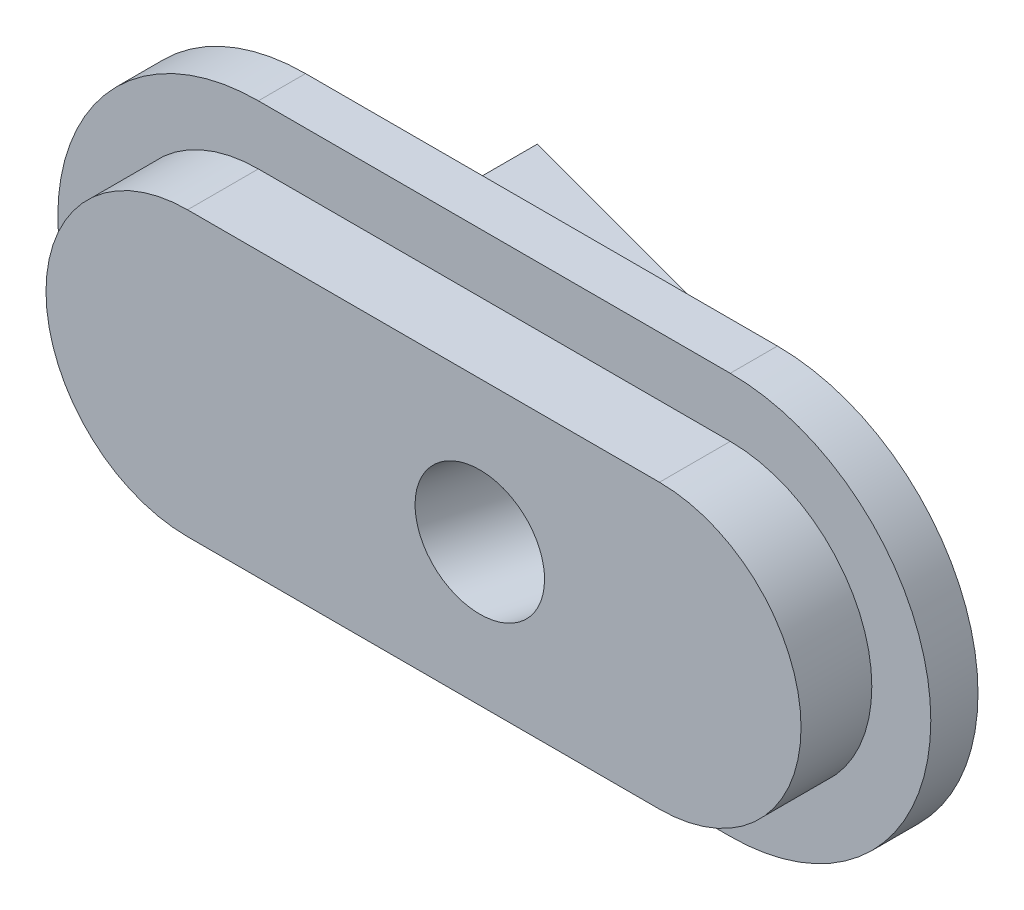
ISO-10303-21;
HEADER;
FILE_DESCRIPTION(('STEP AP214'),'2;1');
FILE_NAME('part.step','',(''),(''),'','','');
FILE_SCHEMA(('AUTOMOTIVE_DESIGN { 1 0 10303 214 1 1 1 1 }'));
ENDSEC;
DATA;
#1=APPLICATION_CONTEXT('core data for automotive mechanical design processes');
#2=APPLICATION_PROTOCOL_DEFINITION('international standard','automotive_design',2000,#1);
#3=PRODUCT_CONTEXT('',#1,'mechanical');
#4=PRODUCT('Part','Part','',(#3));
#5=PRODUCT_RELATED_PRODUCT_CATEGORY('part','',(#4));
#6=PRODUCT_DEFINITION_FORMATION('','',#4);
#7=PRODUCT_DEFINITION_CONTEXT('part definition',#1,'design');
#8=PRODUCT_DEFINITION('design','',#6,#7);
#9=PRODUCT_DEFINITION_SHAPE('','',#8);
#10=(LENGTH_UNIT() NAMED_UNIT(*) SI_UNIT(.MILLI.,.METRE.));
#11=(NAMED_UNIT(*) PLANE_ANGLE_UNIT() SI_UNIT($,.RADIAN.));
#12=(NAMED_UNIT(*) SI_UNIT($,.STERADIAN.) SOLID_ANGLE_UNIT());
#13=UNCERTAINTY_MEASURE_WITH_UNIT(LENGTH_MEASURE(1.E-05),#10,'distance_accuracy_value','');
#14=(GEOMETRIC_REPRESENTATION_CONTEXT(3) GLOBAL_UNCERTAINTY_ASSIGNED_CONTEXT((#13)) GLOBAL_UNIT_ASSIGNED_CONTEXT((#10,
#11,#12)) REPRESENTATION_CONTEXT('',''));
#15=CARTESIAN_POINT('',(0.,0.,0.));
#16=DIRECTION('',(0.,0.,1.));
#17=DIRECTION('',(1.,0.,0.));
#18=AXIS2_PLACEMENT_3D('',#15,#16,#17);
#19=CARTESIAN_POINT('',(-10.,0.,5.));
#20=DIRECTION('',(0.,0.,-1.));
#21=DIRECTION('',(-1.,0.,0.));
#22=AXIS2_PLACEMENT_3D('',#19,#20,#21);
#23=CYLINDRICAL_SURFACE('',#22,6.);
#24=DIRECTION('',(0.,0.,-1.));
#25=VECTOR('',#24,1.);
#26=CARTESIAN_POINT('',(-10.,-5.99999999999999,5.));
#27=LINE('',#26,#25);
#28=CARTESIAN_POINT('',(-10.,-5.99999999999999,0.));
#29=VERTEX_POINT('',#28);
#30=CARTESIAN_POINT('',(-10.,-5.99999999999999,-3.));
#31=VERTEX_POINT('',#30);
#32=EDGE_CURVE('E70',#29,#31,#27,.T.);
#33=ORIENTED_EDGE('',*,*,#32,.F.);
#34=CARTESIAN_POINT('',(-10.,0.,0.));
#35=DIRECTION('',(0.,0.,-1.));
#36=DIRECTION('',(-1.,0.,0.));
#37=AXIS2_PLACEMENT_3D('',#34,#35,#36);
#38=CIRCLE('',#37,6.);
#39=CARTESIAN_POINT('',(-10.,6.00000000000001,0.));
#40=VERTEX_POINT('',#39);
#41=EDGE_CURVE('E132',#29,#40,#38,.T.);
#42=ORIENTED_EDGE('',*,*,#41,.T.);
#43=DIRECTION('',(0.,0.,-1.));
#44=VECTOR('',#43,1.);
#45=CARTESIAN_POINT('',(-10.,6.00000000000001,5.));
#46=LINE('',#45,#44);
#47=CARTESIAN_POINT('',(-10.,6.00000000000001,-3.));
#48=VERTEX_POINT('',#47);
#49=EDGE_CURVE('E139',#40,#48,#46,.T.);
#50=ORIENTED_EDGE('',*,*,#49,.T.);
#51=CARTESIAN_POINT('',(-10.,0.,-3.));
#52=DIRECTION('',(0.,0.,-1.));
#53=DIRECTION('',(-1.,0.,0.));
#54=AXIS2_PLACEMENT_3D('',#51,#52,#53);
#55=CIRCLE('',#54,6.);
#56=EDGE_CURVE('E213',#31,#48,#55,.T.);
#57=ORIENTED_EDGE('',*,*,#56,.F.);
#58=EDGE_LOOP('',(#33,#42,#50,#57));
#59=FACE_BOUND('',#58,.T.);
#60=ADVANCED_FACE('F45',(#59),#23,.T.);
#61=CARTESIAN_POINT('',(-10.,-5.99999999999999,5.));
#62=DIRECTION('',(0.,1.,0.));
#63=DIRECTION('',(0.,0.,1.));
#64=AXIS2_PLACEMENT_3D('',#61,#62,#63);
#65=PLANE('',#64);
#66=DIRECTION('',(0.,0.,-1.));
#67=VECTOR('',#66,1.);
#68=CARTESIAN_POINT('',(10.,-6.,5.));
#69=LINE('',#68,#67);
#70=CARTESIAN_POINT('',(10.,-6.,0.));
#71=VERTEX_POINT('',#70);
#72=CARTESIAN_POINT('',(10.,-6.,-3.));
#73=VERTEX_POINT('',#72);
#74=EDGE_CURVE('E153',#71,#73,#69,.T.);
#75=ORIENTED_EDGE('',*,*,#74,.F.);
#76=DIRECTION('',(-1.,0.,0.));
#77=VECTOR('',#76,1.);
#78=CARTESIAN_POINT('',(-10.,-5.99999999999999,0.));
#79=LINE('',#78,#77);
#80=EDGE_CURVE('E143',#71,#29,#79,.T.);
#81=ORIENTED_EDGE('',*,*,#80,.T.);
#82=ORIENTED_EDGE('',*,*,#32,.T.);
#83=DIRECTION('',(-1.,0.,0.));
#84=VECTOR('',#83,1.);
#85=CARTESIAN_POINT('',(-10.,-5.99999999999999,-3.));
#86=LINE('',#85,#84);
#87=EDGE_CURVE('E209',#73,#31,#86,.T.);
#88=ORIENTED_EDGE('',*,*,#87,.F.);
#89=EDGE_LOOP('',(#75,#81,#82,#88));
#90=FACE_BOUND('',#89,.T.);
#91=ADVANCED_FACE('F275',(#90),#65,.F.);
#92=CARTESIAN_POINT('',(10.,0.,5.));
#93=DIRECTION('',(0.,0.,-1.));
#94=DIRECTION('',(-1.,0.,0.));
#95=AXIS2_PLACEMENT_3D('',#92,#93,#94);
#96=CYLINDRICAL_SURFACE('',#95,6.);
#97=DIRECTION('',(0.,0.,-1.));
#98=VECTOR('',#97,1.);
#99=CARTESIAN_POINT('',(10.,6.00000000000001,5.));
#100=LINE('',#99,#98);
#101=CARTESIAN_POINT('',(10.,6.00000000000001,0.));
#102=VERTEX_POINT('',#101);
#103=CARTESIAN_POINT('',(10.,6.00000000000001,-3.));
#104=VERTEX_POINT('',#103);
#105=EDGE_CURVE('E148',#102,#104,#100,.T.);
#106=ORIENTED_EDGE('',*,*,#105,.F.);
#107=CARTESIAN_POINT('',(10.,0.,0.));
#108=DIRECTION('',(0.,0.,-1.));
#109=DIRECTION('',(-1.,0.,0.));
#110=AXIS2_PLACEMENT_3D('',#107,#108,#109);
#111=CIRCLE('',#110,6.);
#112=EDGE_CURVE('E62',#102,#71,#111,.T.);
#113=ORIENTED_EDGE('',*,*,#112,.T.);
#114=ORIENTED_EDGE('',*,*,#74,.T.);
#115=CARTESIAN_POINT('',(10.,0.,-3.));
#116=DIRECTION('',(0.,0.,-1.));
#117=DIRECTION('',(-1.,0.,0.));
#118=AXIS2_PLACEMENT_3D('',#115,#116,#117);
#119=CIRCLE('',#118,6.);
#120=EDGE_CURVE('E194',#104,#73,#119,.T.);
#121=ORIENTED_EDGE('',*,*,#120,.F.);
#122=EDGE_LOOP('',(#106,#113,#114,#121));
#123=FACE_BOUND('',#122,.T.);
#124=ADVANCED_FACE('F273',(#123),#96,.T.);
#125=CARTESIAN_POINT('',(-10.,6.00000000000001,5.));
#126=DIRECTION('',(0.,-1.,0.));
#127=DIRECTION('',(1.,0.,0.));
#128=AXIS2_PLACEMENT_3D('',#125,#126,#127);
#129=PLANE('',#128);
#130=ORIENTED_EDGE('',*,*,#49,.F.);
#131=DIRECTION('',(1.,0.,0.));
#132=VECTOR('',#131,1.);
#133=CARTESIAN_POINT('',(-10.,6.00000000000001,0.));
#134=LINE('',#133,#132);
#135=EDGE_CURVE('E129',#40,#102,#134,.T.);
#136=ORIENTED_EDGE('',*,*,#135,.T.);
#137=ORIENTED_EDGE('',*,*,#105,.T.);
#138=DIRECTION('',(1.,0.,0.));
#139=VECTOR('',#138,1.);
#140=CARTESIAN_POINT('',(-10.,6.00000000000001,-3.));
#141=LINE('',#140,#139);
#142=EDGE_CURVE('E11',#48,#104,#141,.T.);
#143=ORIENTED_EDGE('',*,*,#142,.F.);
#144=EDGE_LOOP('',(#130,#136,#137,#143));
#145=FACE_BOUND('',#144,.T.);
#146=ADVANCED_FACE('F145',(#145),#129,.F.);
#147=CARTESIAN_POINT('',(-10.,0.,-3.));
#148=DIRECTION('',(0.,0.,-1.));
#149=DIRECTION('',(1.,0.,0.));
#150=AXIS2_PLACEMENT_3D('',#147,#148,#149);
#151=PLANE('',#150);
#152=CARTESIAN_POINT('',(-10.,0.,-3.));
#153=DIRECTION('',(0.,0.,1.));
#154=DIRECTION('',(1.,0.,0.));
#155=AXIS2_PLACEMENT_3D('',#152,#153,#154);
#156=CIRCLE('',#155,8.5);
#157=CARTESIAN_POINT('',(-10.,8.50000000000001,-3.));
#158=VERTEX_POINT('',#157);
#159=CARTESIAN_POINT('',(-10.,-8.49999999999999,-3.));
#160=VERTEX_POINT('',#159);
#161=EDGE_CURVE('E189',#158,#160,#156,.T.);
#162=ORIENTED_EDGE('',*,*,#161,.T.);
#163=DIRECTION('',(1.,0.,0.));
#164=VECTOR('',#163,1.);
#165=CARTESIAN_POINT('',(-10.,-8.49999999999999,-3.));
#166=LINE('',#165,#164);
#167=CARTESIAN_POINT('',(10.,-8.49999999999999,-3.));
#168=VERTEX_POINT('',#167);
#169=EDGE_CURVE('E181',#160,#168,#166,.T.);
#170=ORIENTED_EDGE('',*,*,#169,.T.);
#171=CARTESIAN_POINT('',(10.,0.,-3.));
#172=DIRECTION('',(0.,0.,1.));
#173=DIRECTION('',(1.,0.,0.));
#174=AXIS2_PLACEMENT_3D('',#171,#172,#173);
#175=CIRCLE('',#174,8.5);
#176=CARTESIAN_POINT('',(10.,8.50000000000001,-3.));
#177=VERTEX_POINT('',#176);
#178=EDGE_CURVE('E258',#168,#177,#175,.T.);
#179=ORIENTED_EDGE('',*,*,#178,.T.);
#180=DIRECTION('',(-1.,0.,0.));
#181=VECTOR('',#180,1.);
#182=CARTESIAN_POINT('',(-10.,8.50000000000001,-3.));
#183=LINE('',#182,#181);
#184=EDGE_CURVE('E260',#177,#158,#183,.T.);
#185=ORIENTED_EDGE('',*,*,#184,.T.);
#186=EDGE_LOOP('',(#162,#170,#179,#185));
#187=FACE_BOUND('',#186,.T.);
#188=ORIENTED_EDGE('',*,*,#87,.T.);
#189=ORIENTED_EDGE('',*,*,#56,.T.);
#190=ORIENTED_EDGE('',*,*,#142,.T.);
#191=ORIENTED_EDGE('',*,*,#120,.T.);
#192=EDGE_LOOP('',(#188,#189,#190,#191));
#193=FACE_BOUND('',#192,.T.);
#194=ADVANCED_FACE('F277',(#187,#193),#151,.F.);
#195=CARTESIAN_POINT('',(-10.,0.,-3.));
#196=DIRECTION('',(0.,0.,-1.));
#197=DIRECTION('',(-1.,0.,0.));
#198=AXIS2_PLACEMENT_3D('',#195,#196,#197);
#199=CYLINDRICAL_SURFACE('',#198,8.5);
#200=CARTESIAN_POINT('',(-10.,0.,-5.));
#201=DIRECTION('',(0.,0.,1.));
#202=DIRECTION('',(1.,0.,0.));
#203=AXIS2_PLACEMENT_3D('',#200,#201,#202);
#204=CIRCLE('',#203,8.5);
#205=CARTESIAN_POINT('',(-10.,8.50000000000001,-5.));
#206=VERTEX_POINT('',#205);
#207=CARTESIAN_POINT('',(-10.,-8.49999999999999,-5.));
#208=VERTEX_POINT('',#207);
#209=EDGE_CURVE('E166',#206,#208,#204,.T.);
#210=ORIENTED_EDGE('',*,*,#209,.T.);
#211=DIRECTION('',(0.,0.,-1.));
#212=VECTOR('',#211,1.);
#213=CARTESIAN_POINT('',(-10.,-8.49999999999999,-3.));
#214=LINE('',#213,#212);
#215=EDGE_CURVE('E190',#160,#208,#214,.T.);
#216=ORIENTED_EDGE('',*,*,#215,.F.);
#217=ORIENTED_EDGE('',*,*,#161,.F.);
#218=DIRECTION('',(0.,0.,-1.));
#219=VECTOR('',#218,1.);
#220=CARTESIAN_POINT('',(-10.,8.50000000000001,-3.));
#221=LINE('',#220,#219);
#222=EDGE_CURVE('E203',#158,#206,#221,.T.);
#223=ORIENTED_EDGE('',*,*,#222,.T.);
#224=EDGE_LOOP('',(#210,#216,#217,#223));
#225=FACE_BOUND('',#224,.T.);
#226=ADVANCED_FACE('F279',(#225),#199,.T.);
#227=CARTESIAN_POINT('',(-10.,-8.49999999999999,-3.));
#228=DIRECTION('',(0.,1.,0.));
#229=DIRECTION('',(0.,0.,1.));
#230=AXIS2_PLACEMENT_3D('',#227,#228,#229);
#231=PLANE('',#230);
#232=DIRECTION('',(1.,0.,0.));
#233=VECTOR('',#232,1.);
#234=CARTESIAN_POINT('',(-10.,-8.49999999999999,-5.));
#235=LINE('',#234,#233);
#236=CARTESIAN_POINT('',(10.,-8.49999999999999,-5.));
#237=VERTEX_POINT('',#236);
#238=EDGE_CURVE('E186',#208,#237,#235,.T.);
#239=ORIENTED_EDGE('',*,*,#238,.T.);
#240=DIRECTION('',(0.,0.,-1.));
#241=VECTOR('',#240,1.);
#242=CARTESIAN_POINT('',(10.,-8.49999999999999,-3.));
#243=LINE('',#242,#241);
#244=EDGE_CURVE('E195',#168,#237,#243,.T.);
#245=ORIENTED_EDGE('',*,*,#244,.F.);
#246=ORIENTED_EDGE('',*,*,#169,.F.);
#247=ORIENTED_EDGE('',*,*,#215,.T.);
#248=EDGE_LOOP('',(#239,#245,#246,#247));
#249=FACE_BOUND('',#248,.T.);
#250=ADVANCED_FACE('F284',(#249),#231,.F.);
#251=CARTESIAN_POINT('',(10.,0.,-3.));
#252=DIRECTION('',(0.,0.,-1.));
#253=DIRECTION('',(-1.,0.,0.));
#254=AXIS2_PLACEMENT_3D('',#251,#252,#253);
#255=CYLINDRICAL_SURFACE('',#254,8.5);
#256=CARTESIAN_POINT('',(10.,0.,-5.));
#257=DIRECTION('',(0.,0.,1.));
#258=DIRECTION('',(1.,0.,0.));
#259=AXIS2_PLACEMENT_3D('',#256,#257,#258);
#260=CIRCLE('',#259,8.5);
#261=CARTESIAN_POINT('',(10.,8.50000000000001,-5.));
#262=VERTEX_POINT('',#261);
#263=EDGE_CURVE('E178',#237,#262,#260,.T.);
#264=ORIENTED_EDGE('',*,*,#263,.T.);
#265=DIRECTION('',(0.,0.,-1.));
#266=VECTOR('',#265,1.);
#267=CARTESIAN_POINT('',(10.,8.50000000000001,-3.));
#268=LINE('',#267,#266);
#269=EDGE_CURVE('E199',#177,#262,#268,.T.);
#270=ORIENTED_EDGE('',*,*,#269,.F.);
#271=ORIENTED_EDGE('',*,*,#178,.F.);
#272=ORIENTED_EDGE('',*,*,#244,.T.);
#273=EDGE_LOOP('',(#264,#270,#271,#272));
#274=FACE_BOUND('',#273,.T.);
#275=ADVANCED_FACE('F318',(#274),#255,.T.);
#276=CARTESIAN_POINT('',(-10.,8.50000000000001,-3.));
#277=DIRECTION('',(0.,-1.,0.));
#278=DIRECTION('',(0.,0.,-1.));
#279=AXIS2_PLACEMENT_3D('',#276,#277,#278);
#280=PLANE('',#279);
#281=DIRECTION('',(-1.,0.,0.));
#282=VECTOR('',#281,1.);
#283=CARTESIAN_POINT('',(-10.,8.50000000000001,-5.));
#284=LINE('',#283,#282);
#285=EDGE_CURVE('E171',#262,#206,#284,.T.);
#286=ORIENTED_EDGE('',*,*,#285,.T.);
#287=ORIENTED_EDGE('',*,*,#222,.F.);
#288=ORIENTED_EDGE('',*,*,#184,.F.);
#289=ORIENTED_EDGE('',*,*,#269,.T.);
#290=EDGE_LOOP('',(#286,#287,#288,#289));
#291=FACE_BOUND('',#290,.T.);
#292=ADVANCED_FACE('F313',(#291),#280,.F.);
#293=CARTESIAN_POINT('',(-10.,0.,-5.));
#294=DIRECTION('',(0.,0.,1.));
#295=DIRECTION('',(1.,0.,0.));
#296=AXIS2_PLACEMENT_3D('',#293,#294,#295);
#297=PLANE('',#296);
#298=DIRECTION('',(0.,-1.,0.));
#299=VECTOR('',#298,1.);
#300=CARTESIAN_POINT('',(-5.,24.6349712473815,-5.));
#301=LINE('',#300,#299);
#302=CARTESIAN_POINT('',(-5.,6.00000000000001,-5.));
#303=VERTEX_POINT('',#302);
#304=CARTESIAN_POINT('',(-5.,-5.99999999999999,-5.));
#305=VERTEX_POINT('',#304);
#306=EDGE_CURVE('E227',#303,#305,#301,.T.);
#307=ORIENTED_EDGE('',*,*,#306,.T.);
#308=DIRECTION('',(-1.,0.,0.));
#309=VECTOR('',#308,1.);
#310=CARTESIAN_POINT('',(13.,-5.99999999999999,-5.));
#311=LINE('',#310,#309);
#312=CARTESIAN_POINT('',(13.,-5.99999999999999,-5.));
#313=VERTEX_POINT('',#312);
#314=EDGE_CURVE('E220',#313,#305,#311,.T.);
#315=ORIENTED_EDGE('',*,*,#314,.F.);
#316=DIRECTION('',(0.,-1.,0.));
#317=VECTOR('',#316,1.);
#318=CARTESIAN_POINT('',(13.,24.6349712473815,-5.));
#319=LINE('',#318,#317);
#320=CARTESIAN_POINT('',(13.,6.00000000000001,-5.));
#321=VERTEX_POINT('',#320);
#322=EDGE_CURVE('E54',#321,#313,#319,.T.);
#323=ORIENTED_EDGE('',*,*,#322,.F.);
#324=DIRECTION('',(-1.,0.,0.));
#325=VECTOR('',#324,1.);
#326=CARTESIAN_POINT('',(13.,6.00000000000001,-5.));
#327=LINE('',#326,#325);
#328=EDGE_CURVE('E149',#321,#303,#327,.T.);
#329=ORIENTED_EDGE('',*,*,#328,.T.);
#330=EDGE_LOOP('',(#307,#315,#323,#329));
#331=FACE_BOUND('',#330,.T.);
#332=ORIENTED_EDGE('',*,*,#209,.F.);
#333=ORIENTED_EDGE('',*,*,#285,.F.);
#334=ORIENTED_EDGE('',*,*,#263,.F.);
#335=ORIENTED_EDGE('',*,*,#238,.F.);
#336=EDGE_LOOP('',(#332,#333,#334,#335));
#337=FACE_BOUND('',#336,.T.);
#338=ADVANCED_FACE('F244',(#331,#337),#297,.F.);
#339=CARTESIAN_POINT('',(-5.,24.6349712473815,-5.));
#340=DIRECTION('',(1.,0.,0.));
#341=DIRECTION('',(0.,0.,-1.));
#342=AXIS2_PLACEMENT_3D('',#339,#340,#341);
#343=PLANE('',#342);
#344=ORIENTED_EDGE('',*,*,#306,.F.);
#345=DIRECTION('',(0.,0.,-1.));
#346=VECTOR('',#345,1.);
#347=CARTESIAN_POINT('',(-5.,6.00000000000001,-5.));
#348=LINE('',#347,#346);
#349=CARTESIAN_POINT('',(-5.,6.00000000000001,-9.82308546376008));
#350=VERTEX_POINT('',#349);
#351=EDGE_CURVE('E158',#303,#350,#348,.T.);
#352=ORIENTED_EDGE('',*,*,#351,.T.);
#353=DIRECTION('',(0.,-1.,0.));
#354=VECTOR('',#353,1.);
#355=CARTESIAN_POINT('',(-5.,24.6349712473815,-9.82308546376008));
#356=LINE('',#355,#354);
#357=CARTESIAN_POINT('',(-5.,-5.99999999999999,-9.82308546376008));
#358=VERTEX_POINT('',#357);
#359=EDGE_CURVE('E234',#350,#358,#356,.T.);
#360=ORIENTED_EDGE('',*,*,#359,.T.);
#361=DIRECTION('',(0.,0.,-1.));
#362=VECTOR('',#361,1.);
#363=CARTESIAN_POINT('',(-5.,-5.99999999999999,-5.));
#364=LINE('',#363,#362);
#365=EDGE_CURVE('E216',#305,#358,#364,.T.);
#366=ORIENTED_EDGE('',*,*,#365,.F.);
#367=EDGE_LOOP('',(#344,#352,#360,#366));
#368=FACE_BOUND('',#367,.T.);
#369=ADVANCED_FACE('F251',(#368),#343,.F.);
#370=CARTESIAN_POINT('',(-5.,24.6349712473815,-9.82308546376008));
#371=DIRECTION('',(-0.258819045102514,0.,0.96592582628907));
#372=DIRECTION('',(0.96592582628907,0.,0.258819045102514));
#373=AXIS2_PLACEMENT_3D('',#370,#371,#372);
#374=PLANE('',#373);
#375=CARTESIAN_POINT('',(4.34621437056311,0.,-7.31877487087961));
#376=DIRECTION('',(-0.258819045102514,0.,0.96592582628907));
#377=DIRECTION('',(0.96592582628907,0.,0.258819045102514));
#378=AXIS2_PLACEMENT_3D('',#375,#376,#377);
#379=CIRCLE('',#378,2.65);
#380=CARTESIAN_POINT('',(6.90591781022914,0.,-6.63290440135795));
#381=VERTEX_POINT('',#380);
#382=EDGE_CURVE('E142',#381,#381,#379,.T.);
#383=ORIENTED_EDGE('',*,*,#382,.T.);
#384=EDGE_LOOP('',(#383));
#385=FACE_BOUND('',#384,.T.);
#386=ORIENTED_EDGE('',*,*,#359,.F.);
#387=DIRECTION('',(0.96592582628907,0.,0.258819045102514));
#388=VECTOR('',#387,1.);
#389=CARTESIAN_POINT('',(-5.,6.00000000000001,-9.82308546376008));
#390=LINE('',#389,#388);
#391=EDGE_CURVE('E155',#350,#321,#390,.T.);
#392=ORIENTED_EDGE('',*,*,#391,.T.);
#393=ORIENTED_EDGE('',*,*,#322,.T.);
#394=DIRECTION('',(0.96592582628907,0.,0.258819045102514));
#395=VECTOR('',#394,1.);
#396=CARTESIAN_POINT('',(-5.,-5.99999999999999,-9.82308546376008));
#397=LINE('',#396,#395);
#398=EDGE_CURVE('E223',#358,#313,#397,.T.);
#399=ORIENTED_EDGE('',*,*,#398,.F.);
#400=EDGE_LOOP('',(#386,#392,#393,#399));
#401=FACE_BOUND('',#400,.T.);
#402=ADVANCED_FACE('F241',(#385,#401),#374,.F.);
#403=ORIENTED_EDGE('',*,*,#351,.F.);
#404=ORIENTED_EDGE('',*,*,#328,.F.);
#405=ORIENTED_EDGE('',*,*,#391,.F.);
#406=EDGE_LOOP('',(#403,#404,#405));
#407=FACE_BOUND('',#406,.T.);
#408=ADVANCED_FACE('F288',(#407),#129,.F.);
#409=ORIENTED_EDGE('',*,*,#314,.T.);
#410=ORIENTED_EDGE('',*,*,#365,.T.);
#411=ORIENTED_EDGE('',*,*,#398,.T.);
#412=EDGE_LOOP('',(#409,#410,#411));
#413=FACE_BOUND('',#412,.T.);
#414=ADVANCED_FACE('F249',(#413),#65,.F.);
#415=CARTESIAN_POINT('',(5.92041587609588,0.,-13.1937748708795));
#416=DIRECTION('',(-0.258819045102514,0.,0.96592582628907));
#417=DIRECTION('',(0.96592582628907,0.,0.258819045102514));
#418=AXIS2_PLACEMENT_3D('',#415,#416,#417);
#419=CYLINDRICAL_SURFACE('',#418,2.65);
#420=CARTESIAN_POINT('',(2.38515455432578,0.,0.));
#421=DIRECTION('',(0.,0.,-1.));
#422=DIRECTION('',(-1.,0.,0.));
#423=AXIS2_PLACEMENT_3D('',#420,#421,#422);
#424=ELLIPSE('',#423,2.74348187808671,2.65);
#425=CARTESIAN_POINT('',(-0.358327323760938,0.,0.));
#426=VERTEX_POINT('',#425);
#427=EDGE_CURVE('E48',#426,#426,#424,.F.);
#428=ORIENTED_EDGE('',*,*,#427,.T.);
#429=EDGE_LOOP('',(#428));
#430=FACE_BOUND('',#429,.T.);
#431=ORIENTED_EDGE('',*,*,#382,.F.);
#432=EDGE_LOOP('',(#431));
#433=FACE_BOUND('',#432,.T.);
#434=ADVANCED_FACE('F301',(#430,#433),#419,.F.);
#435=CARTESIAN_POINT('',(-32.6566863788659,-24.5,0.));
#436=DIRECTION('',(0.,0.,-1.));
#437=DIRECTION('',(-1.,0.,0.));
#438=AXIS2_PLACEMENT_3D('',#435,#436,#437);
#439=PLANE('',#438);
#440=ORIENTED_EDGE('',*,*,#427,.F.);
#441=EDGE_LOOP('',(#440));
#442=FACE_BOUND('',#441,.T.);
#443=ORIENTED_EDGE('',*,*,#80,.F.);
#444=ORIENTED_EDGE('',*,*,#112,.F.);
#445=ORIENTED_EDGE('',*,*,#135,.F.);
#446=ORIENTED_EDGE('',*,*,#41,.F.);
#447=EDGE_LOOP('',(#443,#444,#445,#446));
#448=FACE_BOUND('',#447,.T.);
#449=ADVANCED_FACE('F131',(#442,#448),#439,.F.);
#450=CLOSED_SHELL('',(#60,#91,#124,#146,#194,#226,#250,#275,#292,#338,#369,#402,#408,#414,#434,#449));
#451=MANIFOLD_SOLID_BREP('B2',#450);
#452=ADVANCED_BREP_SHAPE_REPRESENTATION('',(#18,#451),#14);
#453=SHAPE_DEFINITION_REPRESENTATION(#9,#452);
ENDSEC;
END-ISO-10303-21;
